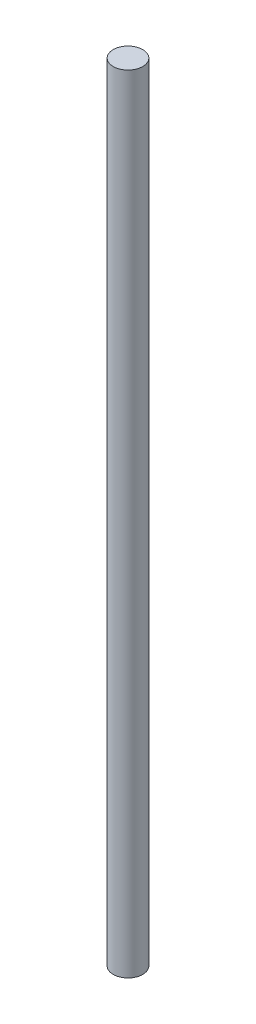
ISO-10303-21;
HEADER;
FILE_DESCRIPTION(('STEP AP214'),'2;1');
FILE_NAME('part.step','',(''),(''),'','','');
FILE_SCHEMA(('AUTOMOTIVE_DESIGN { 1 0 10303 214 1 1 1 1 }'));
ENDSEC;
DATA;
#1=APPLICATION_CONTEXT('core data for automotive mechanical design processes');
#2=APPLICATION_PROTOCOL_DEFINITION('international standard','automotive_design',2000,#1);
#3=PRODUCT_CONTEXT('',#1,'mechanical');
#4=PRODUCT('Part','Part','',(#3));
#5=PRODUCT_RELATED_PRODUCT_CATEGORY('part','',(#4));
#6=PRODUCT_DEFINITION_FORMATION('','',#4);
#7=PRODUCT_DEFINITION_CONTEXT('part definition',#1,'design');
#8=PRODUCT_DEFINITION('design','',#6,#7);
#9=PRODUCT_DEFINITION_SHAPE('','',#8);
#10=(LENGTH_UNIT() NAMED_UNIT(*) SI_UNIT(.MILLI.,.METRE.));
#11=(NAMED_UNIT(*) PLANE_ANGLE_UNIT() SI_UNIT($,.RADIAN.));
#12=(NAMED_UNIT(*) SI_UNIT($,.STERADIAN.) SOLID_ANGLE_UNIT());
#13=UNCERTAINTY_MEASURE_WITH_UNIT(LENGTH_MEASURE(1.E-05),#10,'distance_accuracy_value','');
#14=(GEOMETRIC_REPRESENTATION_CONTEXT(3) GLOBAL_UNCERTAINTY_ASSIGNED_CONTEXT((#13)) GLOBAL_UNIT_ASSIGNED_CONTEXT((#10,
#11,#12)) REPRESENTATION_CONTEXT('',''));
#15=CARTESIAN_POINT('',(0.,0.,0.));
#16=DIRECTION('',(0.,0.,1.));
#17=DIRECTION('',(1.,0.,0.));
#18=AXIS2_PLACEMENT_3D('',#15,#16,#17);
#19=CARTESIAN_POINT('',(0.,200.,0.));
#20=DIRECTION('',(0.,-1.,0.));
#21=DIRECTION('',(0.,0.,-1.));
#22=AXIS2_PLACEMENT_3D('',#19,#20,#21);
#23=CYLINDRICAL_SURFACE('',#22,3.75);
#24=CARTESIAN_POINT('',(0.,200.,0.));
#25=DIRECTION('',(0.,1.,0.));
#26=DIRECTION('',(0.,0.,1.));
#27=AXIS2_PLACEMENT_3D('',#24,#25,#26);
#28=CIRCLE('',#27,3.75);
#29=CARTESIAN_POINT('',(0.,200.,3.75));
#30=VERTEX_POINT('',#29);
#31=EDGE_CURVE('E10',#30,#30,#28,.T.);
#32=ORIENTED_EDGE('',*,*,#31,.F.);
#33=EDGE_LOOP('',(#32));
#34=FACE_BOUND('',#33,.T.);
#35=CARTESIAN_POINT('',(0.,0.,0.));
#36=DIRECTION('',(0.,1.,0.));
#37=DIRECTION('',(0.,0.,1.));
#38=AXIS2_PLACEMENT_3D('',#35,#36,#37);
#39=CIRCLE('',#38,3.75);
#40=CARTESIAN_POINT('',(0.,0.,3.75));
#41=VERTEX_POINT('',#40);
#42=EDGE_CURVE('E34',#41,#41,#39,.T.);
#43=ORIENTED_EDGE('',*,*,#42,.T.);
#44=EDGE_LOOP('',(#43));
#45=FACE_BOUND('',#44,.T.);
#46=ADVANCED_FACE('F31',(#34,#45),#23,.T.);
#47=CARTESIAN_POINT('',(0.,200.,0.));
#48=DIRECTION('',(0.,1.,0.));
#49=DIRECTION('',(0.,0.,1.));
#50=AXIS2_PLACEMENT_3D('',#47,#48,#49);
#51=PLANE('',#50);
#52=ORIENTED_EDGE('',*,*,#31,.T.);
#53=EDGE_LOOP('',(#52));
#54=FACE_BOUND('',#53,.T.);
#55=ADVANCED_FACE('F46',(#54),#51,.T.);
#56=CARTESIAN_POINT('',(0.,0.,0.));
#57=DIRECTION('',(0.,1.,0.));
#58=DIRECTION('',(0.,0.,1.));
#59=AXIS2_PLACEMENT_3D('',#56,#57,#58);
#60=PLANE('',#59);
#61=ORIENTED_EDGE('',*,*,#42,.F.);
#62=EDGE_LOOP('',(#61));
#63=FACE_BOUND('',#62,.T.);
#64=ADVANCED_FACE('F44',(#63),#60,.F.);
#65=CLOSED_SHELL('',(#46,#55,#64));
#66=MANIFOLD_SOLID_BREP('B2',#65);
#67=ADVANCED_BREP_SHAPE_REPRESENTATION('',(#18,#66),#14);
#68=SHAPE_DEFINITION_REPRESENTATION(#9,#67);
ENDSEC;
END-ISO-10303-21;
